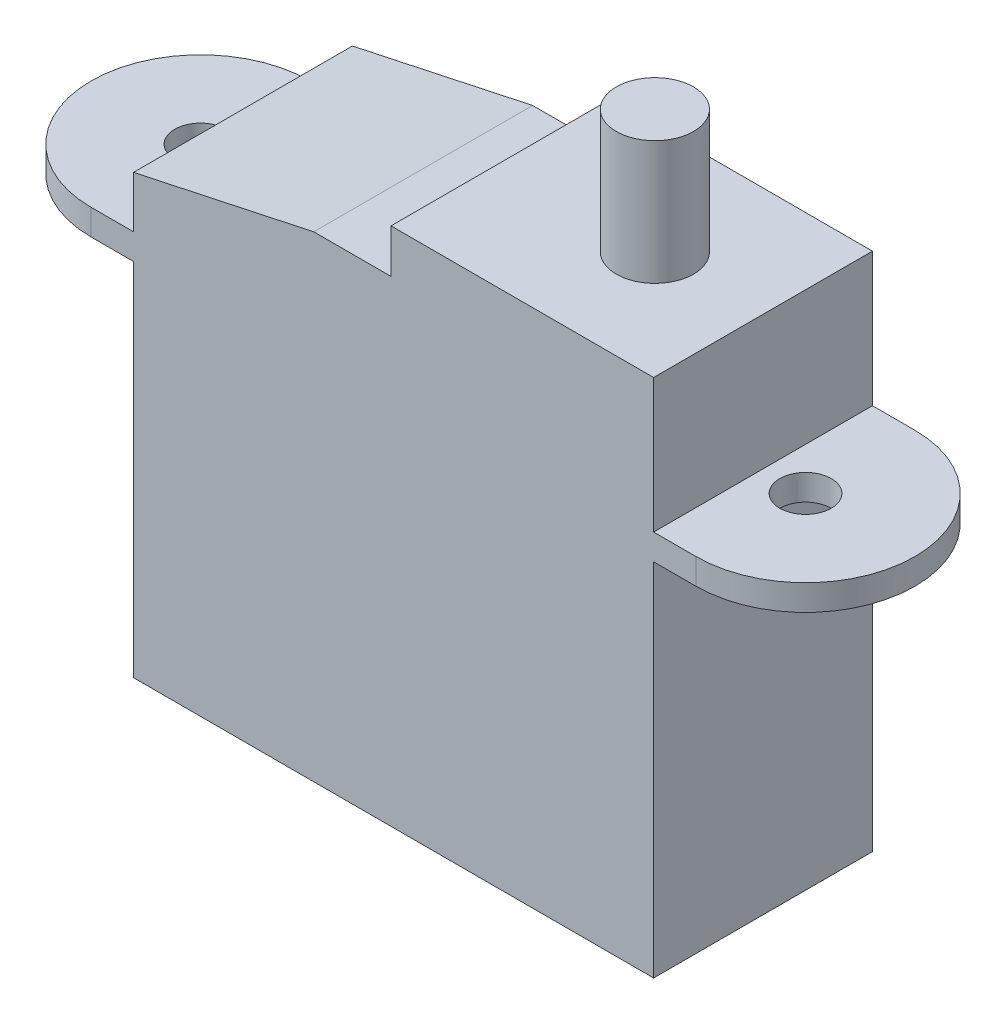
ISO-10303-21;
HEADER;
FILE_DESCRIPTION(('STEP AP214'),'2;1');
FILE_NAME('part.step','',(''),(''),'','','');
FILE_SCHEMA(('AUTOMOTIVE_DESIGN { 1 0 10303 214 1 1 1 1 }'));
ENDSEC;
DATA;
#1=APPLICATION_CONTEXT('core data for automotive mechanical design processes');
#2=APPLICATION_PROTOCOL_DEFINITION('international standard','automotive_design',2000,#1);
#3=PRODUCT_CONTEXT('',#1,'mechanical');
#4=PRODUCT('Part','Part','',(#3));
#5=PRODUCT_RELATED_PRODUCT_CATEGORY('part','',(#4));
#6=PRODUCT_DEFINITION_FORMATION('','',#4);
#7=PRODUCT_DEFINITION_CONTEXT('part definition',#1,'design');
#8=PRODUCT_DEFINITION('design','',#6,#7);
#9=PRODUCT_DEFINITION_SHAPE('','',#8);
#10=(LENGTH_UNIT() NAMED_UNIT(*) SI_UNIT(.MILLI.,.METRE.));
#11=(NAMED_UNIT(*) PLANE_ANGLE_UNIT() SI_UNIT($,.RADIAN.));
#12=(NAMED_UNIT(*) SI_UNIT($,.STERADIAN.) SOLID_ANGLE_UNIT());
#13=UNCERTAINTY_MEASURE_WITH_UNIT(LENGTH_MEASURE(1.E-05),#10,'distance_accuracy_value','');
#14=(GEOMETRIC_REPRESENTATION_CONTEXT(3) GLOBAL_UNCERTAINTY_ASSIGNED_CONTEXT((#13)) GLOBAL_UNIT_ASSIGNED_CONTEXT((#10,
#11,#12)) REPRESENTATION_CONTEXT('',''));
#15=CARTESIAN_POINT('',(0.,0.,0.));
#16=DIRECTION('',(0.,0.,1.));
#17=DIRECTION('',(1.,0.,0.));
#18=AXIS2_PLACEMENT_3D('',#15,#16,#17);
#19=CARTESIAN_POINT('',(-1.65,15.,-4.25));
#20=DIRECTION('',(0.,1.,0.));
#21=DIRECTION('',(0.,0.,1.));
#22=AXIS2_PLACEMENT_3D('',#19,#20,#21);
#23=PLANE('',#22);
#24=CARTESIAN_POINT('',(-1.65,15.,-4.25));
#25=DIRECTION('',(0.,1.,0.));
#26=DIRECTION('',(0.,0.,1.));
#27=AXIS2_PLACEMENT_3D('',#24,#25,#26);
#28=CIRCLE('',#27,1.);
#29=CARTESIAN_POINT('',(-1.65,15.,-3.25));
#30=VERTEX_POINT('',#29);
#31=EDGE_CURVE('E242',#30,#30,#28,.T.);
#32=ORIENTED_EDGE('',*,*,#31,.F.);
#33=EDGE_LOOP('',(#32));
#34=FACE_BOUND('',#33,.T.);
#35=DIRECTION('',(0.,0.,1.));
#36=VECTOR('',#35,1.);
#37=CARTESIAN_POINT('',(0.,15.,0.));
#38=LINE('',#37,#36);
#39=CARTESIAN_POINT('',(0.,15.,-8.5));
#40=VERTEX_POINT('',#39);
#41=CARTESIAN_POINT('',(0.,15.,0.));
#42=VERTEX_POINT('',#41);
#43=EDGE_CURVE('E164',#40,#42,#38,.T.);
#44=ORIENTED_EDGE('',*,*,#43,.F.);
#45=DIRECTION('',(-1.,0.,0.));
#46=VECTOR('',#45,1.);
#47=CARTESIAN_POINT('',(-1.65,15.,-8.5));
#48=LINE('',#47,#46);
#49=CARTESIAN_POINT('',(-1.65,15.,-8.5));
#50=VERTEX_POINT('',#49);
#51=EDGE_CURVE('E183',#40,#50,#48,.T.);
#52=ORIENTED_EDGE('',*,*,#51,.T.);
#53=CARTESIAN_POINT('',(-1.65,15.,-4.25));
#54=DIRECTION('',(0.,1.,0.));
#55=DIRECTION('',(0.,0.,1.));
#56=AXIS2_PLACEMENT_3D('',#53,#54,#55);
#57=CIRCLE('',#56,4.25);
#58=CARTESIAN_POINT('',(-1.65,15.,0.));
#59=VERTEX_POINT('',#58);
#60=EDGE_CURVE('E174',#50,#59,#57,.T.);
#61=ORIENTED_EDGE('',*,*,#60,.T.);
#62=DIRECTION('',(1.,0.,0.));
#63=VECTOR('',#62,1.);
#64=CARTESIAN_POINT('',(-1.65,15.,0.));
#65=LINE('',#64,#63);
#66=EDGE_CURVE('E179',#59,#42,#65,.T.);
#67=ORIENTED_EDGE('',*,*,#66,.T.);
#68=EDGE_LOOP('',(#44,#52,#61,#67));
#69=FACE_BOUND('',#68,.T.);
#70=ADVANCED_FACE('F35',(#34,#69),#23,.T.);
#71=CARTESIAN_POINT('',(0.,14.,0.));
#72=DIRECTION('',(1.,0.,0.));
#73=DIRECTION('',(0.,0.,-1.));
#74=AXIS2_PLACEMENT_3D('',#71,#72,#73);
#75=PLANE('',#74);
#76=DIRECTION('',(0.,0.,1.));
#77=VECTOR('',#76,1.);
#78=CARTESIAN_POINT('',(0.,0.,0.));
#79=LINE('',#78,#77);
#80=CARTESIAN_POINT('',(0.,0.,-8.5));
#81=VERTEX_POINT('',#80);
#82=CARTESIAN_POINT('',(0.,0.,0.));
#83=VERTEX_POINT('',#82);
#84=EDGE_CURVE('E212',#81,#83,#79,.T.);
#85=ORIENTED_EDGE('',*,*,#84,.T.);
#86=DIRECTION('',(0.,-1.,0.));
#87=VECTOR('',#86,1.);
#88=CARTESIAN_POINT('',(0.,14.,0.));
#89=LINE('',#88,#87);
#90=CARTESIAN_POINT('',(0.,14.,0.));
#91=VERTEX_POINT('',#90);
#92=EDGE_CURVE('E236',#91,#83,#89,.T.);
#93=ORIENTED_EDGE('',*,*,#92,.F.);
#94=DIRECTION('',(0.,0.,1.));
#95=VECTOR('',#94,1.);
#96=CARTESIAN_POINT('',(0.,14.,0.));
#97=LINE('',#96,#95);
#98=CARTESIAN_POINT('',(0.,14.,-8.5));
#99=VERTEX_POINT('',#98);
#100=EDGE_CURVE('E213',#99,#91,#97,.T.);
#101=ORIENTED_EDGE('',*,*,#100,.F.);
#102=DIRECTION('',(0.,-1.,0.));
#103=VECTOR('',#102,1.);
#104=CARTESIAN_POINT('',(0.,14.,-8.5));
#105=LINE('',#104,#103);
#106=EDGE_CURVE('E220',#99,#81,#105,.T.);
#107=ORIENTED_EDGE('',*,*,#106,.T.);
#108=EDGE_LOOP('',(#85,#93,#101,#107));
#109=FACE_BOUND('',#108,.T.);
#110=ADVANCED_FACE('F37',(#109),#75,.F.);
#111=CARTESIAN_POINT('',(0.,14.,0.));
#112=DIRECTION('',(0.,0.,-1.));
#113=DIRECTION('',(-1.,0.,0.));
#114=AXIS2_PLACEMENT_3D('',#111,#112,#113);
#115=PLANE('',#114);
#116=DIRECTION('',(-1.,0.,0.));
#117=VECTOR('',#116,1.);
#118=CARTESIAN_POINT('',(0.,20.2,0.));
#119=LINE('',#118,#117);
#120=CARTESIAN_POINT('',(20.2,20.2,0.));
#121=VERTEX_POINT('',#120);
#122=CARTESIAN_POINT('',(10.,20.2,0.));
#123=VERTEX_POINT('',#122);
#124=EDGE_CURVE('E192',#121,#123,#119,.T.);
#125=ORIENTED_EDGE('',*,*,#124,.T.);
#126=DIRECTION('',(0.,1.,0.));
#127=VECTOR('',#126,1.);
#128=CARTESIAN_POINT('',(10.,18.5,0.));
#129=LINE('',#128,#127);
#130=CARTESIAN_POINT('',(10.,18.5,0.));
#131=VERTEX_POINT('',#130);
#132=EDGE_CURVE('E50',#131,#123,#129,.T.);
#133=ORIENTED_EDGE('',*,*,#132,.F.);
#134=DIRECTION('',(1.,0.,0.));
#135=VECTOR('',#134,1.);
#136=CARTESIAN_POINT('',(7.,18.5,0.));
#137=LINE('',#136,#135);
#138=CARTESIAN_POINT('',(7.,18.5,0.));
#139=VERTEX_POINT('',#138);
#140=EDGE_CURVE('E160',#139,#131,#137,.T.);
#141=ORIENTED_EDGE('',*,*,#140,.F.);
#142=DIRECTION('',(0.977802414077409,0.209529088730874,0.));
#143=VECTOR('',#142,1.);
#144=CARTESIAN_POINT('',(0.,17.,0.));
#145=LINE('',#144,#143);
#146=CARTESIAN_POINT('',(0.,17.,0.));
#147=VERTEX_POINT('',#146);
#148=EDGE_CURVE('E147',#147,#139,#145,.T.);
#149=ORIENTED_EDGE('',*,*,#148,.F.);
#150=DIRECTION('',(0.,-1.,0.));
#151=VECTOR('',#150,1.);
#152=CARTESIAN_POINT('',(0.,62.3155196151038,0.));
#153=LINE('',#152,#151);
#154=EDGE_CURVE('E157',#147,#42,#153,.T.);
#155=ORIENTED_EDGE('',*,*,#154,.T.);
#156=ORIENTED_EDGE('',*,*,#66,.F.);
#157=DIRECTION('',(0.,-1.,0.));
#158=VECTOR('',#157,1.);
#159=CARTESIAN_POINT('',(-1.65,15.,0.));
#160=LINE('',#159,#158);
#161=CARTESIAN_POINT('',(-1.65,14.,0.));
#162=VERTEX_POINT('',#161);
#163=EDGE_CURVE('E209',#59,#162,#160,.T.);
#164=ORIENTED_EDGE('',*,*,#163,.T.);
#165=DIRECTION('',(1.,0.,0.));
#166=VECTOR('',#165,1.);
#167=CARTESIAN_POINT('',(-1.65,14.,0.));
#168=LINE('',#167,#166);
#169=EDGE_CURVE('E193',#162,#91,#168,.T.);
#170=ORIENTED_EDGE('',*,*,#169,.T.);
#171=ORIENTED_EDGE('',*,*,#92,.T.);
#172=DIRECTION('',(1.,0.,0.));
#173=VECTOR('',#172,1.);
#174=CARTESIAN_POINT('',(0.,0.,0.));
#175=LINE('',#174,#173);
#176=CARTESIAN_POINT('',(20.2,0.,0.));
#177=VERTEX_POINT('',#176);
#178=EDGE_CURVE('E223',#83,#177,#175,.T.);
#179=ORIENTED_EDGE('',*,*,#178,.T.);
#180=DIRECTION('',(0.,-1.,0.));
#181=VECTOR('',#180,1.);
#182=CARTESIAN_POINT('',(20.2,14.,0.));
#183=LINE('',#182,#181);
#184=CARTESIAN_POINT('',(20.2,14.,0.));
#185=VERTEX_POINT('',#184);
#186=EDGE_CURVE('E233',#185,#177,#183,.T.);
#187=ORIENTED_EDGE('',*,*,#186,.F.);
#188=CARTESIAN_POINT('',(21.85,14.,0.));
#189=VERTEX_POINT('',#188);
#190=EDGE_CURVE('E191',#185,#189,#168,.T.);
#191=ORIENTED_EDGE('',*,*,#190,.T.);
#192=DIRECTION('',(0.,-1.,0.));
#193=VECTOR('',#192,1.);
#194=CARTESIAN_POINT('',(21.85,15.,0.));
#195=LINE('',#194,#193);
#196=CARTESIAN_POINT('',(21.85,15.,0.));
#197=VERTEX_POINT('',#196);
#198=EDGE_CURVE('E206',#197,#189,#195,.T.);
#199=ORIENTED_EDGE('',*,*,#198,.F.);
#200=CARTESIAN_POINT('',(20.2,15.,0.));
#201=VERTEX_POINT('',#200);
#202=EDGE_CURVE('E177',#201,#197,#65,.T.);
#203=ORIENTED_EDGE('',*,*,#202,.F.);
#204=DIRECTION('',(0.,-1.,0.));
#205=VECTOR('',#204,1.);
#206=CARTESIAN_POINT('',(20.2,62.3155196151038,0.));
#207=LINE('',#206,#205);
#208=EDGE_CURVE('E166',#121,#201,#207,.T.);
#209=ORIENTED_EDGE('',*,*,#208,.F.);
#210=EDGE_LOOP('',(#125,#133,#141,#149,#155,#156,#164,#170,#171,#179,#187,#191,#199,#203,#209));
#211=FACE_BOUND('',#210,.T.);
#212=ADVANCED_FACE('F156',(#211),#115,.F.);
#213=CARTESIAN_POINT('',(20.2,14.,0.));
#214=DIRECTION('',(-1.,0.,0.));
#215=DIRECTION('',(0.,0.,1.));
#216=AXIS2_PLACEMENT_3D('',#213,#214,#215);
#217=PLANE('',#216);
#218=DIRECTION('',(0.,0.,-1.));
#219=VECTOR('',#218,1.);
#220=CARTESIAN_POINT('',(20.2,0.,0.));
#221=LINE('',#220,#219);
#222=CARTESIAN_POINT('',(20.2,0.,-8.5));
#223=VERTEX_POINT('',#222);
#224=EDGE_CURVE('E225',#177,#223,#221,.T.);
#225=ORIENTED_EDGE('',*,*,#224,.T.);
#226=DIRECTION('',(0.,-1.,0.));
#227=VECTOR('',#226,1.);
#228=CARTESIAN_POINT('',(20.2,14.,-8.5));
#229=LINE('',#228,#227);
#230=CARTESIAN_POINT('',(20.2,14.,-8.5));
#231=VERTEX_POINT('',#230);
#232=EDGE_CURVE('E230',#231,#223,#229,.T.);
#233=ORIENTED_EDGE('',*,*,#232,.F.);
#234=DIRECTION('',(0.,0.,-1.));
#235=VECTOR('',#234,1.);
#236=CARTESIAN_POINT('',(20.2,14.,0.));
#237=LINE('',#236,#235);
#238=EDGE_CURVE('E216',#185,#231,#237,.T.);
#239=ORIENTED_EDGE('',*,*,#238,.F.);
#240=ORIENTED_EDGE('',*,*,#186,.T.);
#241=EDGE_LOOP('',(#225,#233,#239,#240));
#242=FACE_BOUND('',#241,.T.);
#243=ADVANCED_FACE('F297',(#242),#217,.F.);
#244=CARTESIAN_POINT('',(0.,14.,-8.5));
#245=DIRECTION('',(0.,0.,1.));
#246=DIRECTION('',(1.,0.,0.));
#247=AXIS2_PLACEMENT_3D('',#244,#245,#246);
#248=PLANE('',#247);
#249=DIRECTION('',(1.,0.,0.));
#250=VECTOR('',#249,1.);
#251=CARTESIAN_POINT('',(0.,18.5,-8.5));
#252=LINE('',#251,#250);
#253=CARTESIAN_POINT('',(7.,18.5,-8.5));
#254=VERTEX_POINT('',#253);
#255=CARTESIAN_POINT('',(10.,18.5,-8.5));
#256=VERTEX_POINT('',#255);
#257=EDGE_CURVE('E43',#254,#256,#252,.T.);
#258=ORIENTED_EDGE('',*,*,#257,.T.);
#259=DIRECTION('',(0.,1.,0.));
#260=VECTOR('',#259,1.);
#261=CARTESIAN_POINT('',(10.,14.,-8.5));
#262=LINE('',#261,#260);
#263=CARTESIAN_POINT('',(10.,20.2,-8.5));
#264=VERTEX_POINT('',#263);
#265=EDGE_CURVE('E260',#256,#264,#262,.T.);
#266=ORIENTED_EDGE('',*,*,#265,.T.);
#267=DIRECTION('',(1.,0.,0.));
#268=VECTOR('',#267,1.);
#269=CARTESIAN_POINT('',(0.,20.2,-8.5));
#270=LINE('',#269,#268);
#271=CARTESIAN_POINT('',(20.2,20.2,-8.5));
#272=VERTEX_POINT('',#271);
#273=EDGE_CURVE('E165',#264,#272,#270,.T.);
#274=ORIENTED_EDGE('',*,*,#273,.T.);
#275=DIRECTION('',(0.,-1.,0.));
#276=VECTOR('',#275,1.);
#277=CARTESIAN_POINT('',(20.2,62.3155196151038,-8.5));
#278=LINE('',#277,#276);
#279=CARTESIAN_POINT('',(20.2,15.,-8.5));
#280=VERTEX_POINT('',#279);
#281=EDGE_CURVE('E170',#272,#280,#278,.T.);
#282=ORIENTED_EDGE('',*,*,#281,.T.);
#283=CARTESIAN_POINT('',(21.85,15.,-8.5));
#284=VERTEX_POINT('',#283);
#285=EDGE_CURVE('E184',#284,#280,#48,.T.);
#286=ORIENTED_EDGE('',*,*,#285,.F.);
#287=DIRECTION('',(0.,-1.,0.));
#288=VECTOR('',#287,1.);
#289=CARTESIAN_POINT('',(21.85,15.,-8.5));
#290=LINE('',#289,#288);
#291=CARTESIAN_POINT('',(21.85,14.,-8.5));
#292=VERTEX_POINT('',#291);
#293=EDGE_CURVE('E203',#284,#292,#290,.T.);
#294=ORIENTED_EDGE('',*,*,#293,.T.);
#295=DIRECTION('',(-1.,0.,0.));
#296=VECTOR('',#295,1.);
#297=CARTESIAN_POINT('',(-1.65,14.,-8.5));
#298=LINE('',#297,#296);
#299=EDGE_CURVE('E178',#292,#231,#298,.T.);
#300=ORIENTED_EDGE('',*,*,#299,.T.);
#301=ORIENTED_EDGE('',*,*,#232,.T.);
#302=DIRECTION('',(-1.,0.,0.));
#303=VECTOR('',#302,1.);
#304=CARTESIAN_POINT('',(0.,0.,-8.5));
#305=LINE('',#304,#303);
#306=EDGE_CURVE('E217',#223,#81,#305,.T.);
#307=ORIENTED_EDGE('',*,*,#306,.T.);
#308=ORIENTED_EDGE('',*,*,#106,.F.);
#309=CARTESIAN_POINT('',(-1.65,14.,-8.5));
#310=VERTEX_POINT('',#309);
#311=EDGE_CURVE('E198',#99,#310,#298,.T.);
#312=ORIENTED_EDGE('',*,*,#311,.T.);
#313=DIRECTION('',(0.,-1.,0.));
#314=VECTOR('',#313,1.);
#315=CARTESIAN_POINT('',(-1.65,15.,-8.5));
#316=LINE('',#315,#314);
#317=EDGE_CURVE('E187',#50,#310,#316,.T.);
#318=ORIENTED_EDGE('',*,*,#317,.F.);
#319=ORIENTED_EDGE('',*,*,#51,.F.);
#320=DIRECTION('',(0.,-1.,0.));
#321=VECTOR('',#320,1.);
#322=CARTESIAN_POINT('',(0.,62.3155196151038,-8.5));
#323=LINE('',#322,#321);
#324=CARTESIAN_POINT('',(0.,17.,-8.5));
#325=VERTEX_POINT('',#324);
#326=EDGE_CURVE('E58',#325,#40,#323,.T.);
#327=ORIENTED_EDGE('',*,*,#326,.F.);
#328=DIRECTION('',(0.97780241407741,0.209529088730874,0.));
#329=VECTOR('',#328,1.);
#330=CARTESIAN_POINT('',(-0.614634146341461,16.8682926829268,-8.5));
#331=LINE('',#330,#329);
#332=EDGE_CURVE('E150',#325,#254,#331,.T.);
#333=ORIENTED_EDGE('',*,*,#332,.T.);
#334=EDGE_LOOP('',(#258,#266,#274,#282,#286,#294,#300,#301,#307,#308,#312,#318,#319,#327,#333));
#335=FACE_BOUND('',#334,.T.);
#336=ADVANCED_FACE('F275',(#335),#248,.F.);
#337=CARTESIAN_POINT('',(0.,0.,0.));
#338=DIRECTION('',(0.,-1.,0.));
#339=DIRECTION('',(0.,0.,-1.));
#340=AXIS2_PLACEMENT_3D('',#337,#338,#339);
#341=PLANE('',#340);
#342=ORIENTED_EDGE('',*,*,#84,.F.);
#343=ORIENTED_EDGE('',*,*,#306,.F.);
#344=ORIENTED_EDGE('',*,*,#224,.F.);
#345=ORIENTED_EDGE('',*,*,#178,.F.);
#346=EDGE_LOOP('',(#342,#343,#344,#345));
#347=FACE_BOUND('',#346,.T.);
#348=ADVANCED_FACE('F302',(#347),#341,.T.);
#349=CARTESIAN_POINT('',(-1.65,14.,-4.25));
#350=DIRECTION('',(0.,1.,0.));
#351=DIRECTION('',(0.,0.,1.));
#352=AXIS2_PLACEMENT_3D('',#349,#350,#351);
#353=PLANE('',#352);
#354=CARTESIAN_POINT('',(-1.65,14.,-4.25));
#355=DIRECTION('',(0.,1.,0.));
#356=DIRECTION('',(0.,0.,1.));
#357=AXIS2_PLACEMENT_3D('',#354,#355,#356);
#358=CIRCLE('',#357,1.);
#359=CARTESIAN_POINT('',(-1.65,14.,-3.25));
#360=VERTEX_POINT('',#359);
#361=EDGE_CURVE('E161',#360,#360,#358,.T.);
#362=ORIENTED_EDGE('',*,*,#361,.T.);
#363=EDGE_LOOP('',(#362));
#364=FACE_BOUND('',#363,.T.);
#365=ORIENTED_EDGE('',*,*,#311,.F.);
#366=ORIENTED_EDGE('',*,*,#100,.T.);
#367=ORIENTED_EDGE('',*,*,#169,.F.);
#368=CARTESIAN_POINT('',(-1.65,14.,-4.25));
#369=DIRECTION('',(0.,1.,0.));
#370=DIRECTION('',(0.,0.,1.));
#371=AXIS2_PLACEMENT_3D('',#368,#369,#370);
#372=CIRCLE('',#371,4.25);
#373=EDGE_CURVE('E188',#310,#162,#372,.T.);
#374=ORIENTED_EDGE('',*,*,#373,.F.);
#375=EDGE_LOOP('',(#365,#366,#367,#374));
#376=FACE_BOUND('',#375,.T.);
#377=ADVANCED_FACE('F314',(#364,#376),#353,.F.);
#378=CARTESIAN_POINT('',(21.85,14.,-4.25));
#379=DIRECTION('',(0.,1.,0.));
#380=DIRECTION('',(0.,0.,1.));
#381=AXIS2_PLACEMENT_3D('',#378,#379,#380);
#382=CIRCLE('',#381,1.);
#383=CARTESIAN_POINT('',(21.85,14.,-3.25));
#384=VERTEX_POINT('',#383);
#385=EDGE_CURVE('E246',#384,#384,#382,.T.);
#386=ORIENTED_EDGE('',*,*,#385,.T.);
#387=EDGE_LOOP('',(#386));
#388=FACE_BOUND('',#387,.T.);
#389=ORIENTED_EDGE('',*,*,#190,.F.);
#390=ORIENTED_EDGE('',*,*,#238,.T.);
#391=ORIENTED_EDGE('',*,*,#299,.F.);
#392=CARTESIAN_POINT('',(21.85,14.,-4.25));
#393=DIRECTION('',(0.,1.,0.));
#394=DIRECTION('',(0.,0.,1.));
#395=AXIS2_PLACEMENT_3D('',#392,#393,#394);
#396=CIRCLE('',#395,4.25);
#397=EDGE_CURVE('E196',#189,#292,#396,.T.);
#398=ORIENTED_EDGE('',*,*,#397,.F.);
#399=EDGE_LOOP('',(#389,#390,#391,#398));
#400=FACE_BOUND('',#399,.T.);
#401=ADVANCED_FACE('F294',(#388,#400),#353,.F.);
#402=CARTESIAN_POINT('',(-1.65,15.,-4.25));
#403=DIRECTION('',(0.,-1.,0.));
#404=DIRECTION('',(0.,0.,-1.));
#405=AXIS2_PLACEMENT_3D('',#402,#403,#404);
#406=CYLINDRICAL_SURFACE('',#405,4.25);
#407=ORIENTED_EDGE('',*,*,#373,.T.);
#408=ORIENTED_EDGE('',*,*,#163,.F.);
#409=ORIENTED_EDGE('',*,*,#60,.F.);
#410=ORIENTED_EDGE('',*,*,#317,.T.);
#411=EDGE_LOOP('',(#407,#408,#409,#410));
#412=FACE_BOUND('',#411,.T.);
#413=ADVANCED_FACE('F312',(#412),#406,.T.);
#414=CARTESIAN_POINT('',(21.85,15.,-4.25));
#415=DIRECTION('',(0.,-1.,0.));
#416=DIRECTION('',(0.,0.,-1.));
#417=AXIS2_PLACEMENT_3D('',#414,#415,#416);
#418=CYLINDRICAL_SURFACE('',#417,4.25);
#419=ORIENTED_EDGE('',*,*,#397,.T.);
#420=ORIENTED_EDGE('',*,*,#293,.F.);
#421=CARTESIAN_POINT('',(21.85,15.,-4.25));
#422=DIRECTION('',(0.,1.,0.));
#423=DIRECTION('',(0.,0.,1.));
#424=AXIS2_PLACEMENT_3D('',#421,#422,#423);
#425=CIRCLE('',#424,4.25);
#426=EDGE_CURVE('E181',#197,#284,#425,.T.);
#427=ORIENTED_EDGE('',*,*,#426,.F.);
#428=ORIENTED_EDGE('',*,*,#198,.T.);
#429=EDGE_LOOP('',(#419,#420,#427,#428));
#430=FACE_BOUND('',#429,.T.);
#431=ADVANCED_FACE('F291',(#430),#418,.T.);
#432=CARTESIAN_POINT('',(21.85,15.,-4.25));
#433=DIRECTION('',(0.,1.,0.));
#434=DIRECTION('',(0.,0.,1.));
#435=AXIS2_PLACEMENT_3D('',#432,#433,#434);
#436=CIRCLE('',#435,1.);
#437=CARTESIAN_POINT('',(21.85,15.,-3.25));
#438=VERTEX_POINT('',#437);
#439=EDGE_CURVE('E251',#438,#438,#436,.T.);
#440=ORIENTED_EDGE('',*,*,#439,.F.);
#441=EDGE_LOOP('',(#440));
#442=FACE_BOUND('',#441,.T.);
#443=DIRECTION('',(0.,0.,-1.));
#444=VECTOR('',#443,1.);
#445=CARTESIAN_POINT('',(20.2,15.,0.));
#446=LINE('',#445,#444);
#447=EDGE_CURVE('E269',#201,#280,#446,.T.);
#448=ORIENTED_EDGE('',*,*,#447,.F.);
#449=ORIENTED_EDGE('',*,*,#202,.T.);
#450=ORIENTED_EDGE('',*,*,#426,.T.);
#451=ORIENTED_EDGE('',*,*,#285,.T.);
#452=EDGE_LOOP('',(#448,#449,#450,#451));
#453=FACE_BOUND('',#452,.T.);
#454=ADVANCED_FACE('F281',(#442,#453),#23,.T.);
#455=CARTESIAN_POINT('',(20.2,62.3155196151038,0.));
#456=DIRECTION('',(-1.,0.,0.));
#457=DIRECTION('',(0.,0.,1.));
#458=AXIS2_PLACEMENT_3D('',#455,#456,#457);
#459=PLANE('',#458);
#460=ORIENTED_EDGE('',*,*,#447,.T.);
#461=ORIENTED_EDGE('',*,*,#281,.F.);
#462=DIRECTION('',(0.,0.,1.));
#463=VECTOR('',#462,1.);
#464=CARTESIAN_POINT('',(20.2,20.2,0.));
#465=LINE('',#464,#463);
#466=EDGE_CURVE('E168',#272,#121,#465,.T.);
#467=ORIENTED_EDGE('',*,*,#466,.T.);
#468=ORIENTED_EDGE('',*,*,#208,.T.);
#469=EDGE_LOOP('',(#460,#461,#467,#468));
#470=FACE_BOUND('',#469,.T.);
#471=ADVANCED_FACE('F285',(#470),#459,.F.);
#472=CARTESIAN_POINT('',(0.,62.3155196151038,0.));
#473=DIRECTION('',(1.,0.,0.));
#474=DIRECTION('',(0.,0.,-1.));
#475=AXIS2_PLACEMENT_3D('',#472,#473,#474);
#476=PLANE('',#475);
#477=ORIENTED_EDGE('',*,*,#154,.F.);
#478=DIRECTION('',(0.,0.,-1.));
#479=VECTOR('',#478,1.);
#480=CARTESIAN_POINT('',(0.,17.,0.));
#481=LINE('',#480,#479);
#482=EDGE_CURVE('E143',#147,#325,#481,.T.);
#483=ORIENTED_EDGE('',*,*,#482,.T.);
#484=ORIENTED_EDGE('',*,*,#326,.T.);
#485=ORIENTED_EDGE('',*,*,#43,.T.);
#486=EDGE_LOOP('',(#477,#483,#484,#485));
#487=FACE_BOUND('',#486,.T.);
#488=ADVANCED_FACE('F163',(#487),#476,.F.);
#489=CARTESIAN_POINT('',(0.,20.2,0.));
#490=DIRECTION('',(0.,-1.,0.));
#491=DIRECTION('',(0.,0.,-1.));
#492=AXIS2_PLACEMENT_3D('',#489,#490,#491);
#493=PLANE('',#492);
#494=CARTESIAN_POINT('',(16.,20.2,-4.25));
#495=DIRECTION('',(0.,-1.,0.));
#496=DIRECTION('',(0.,0.,-1.));
#497=AXIS2_PLACEMENT_3D('',#494,#495,#496);
#498=CIRCLE('',#497,1.5);
#499=CARTESIAN_POINT('',(16.,20.2,-5.75));
#500=VERTEX_POINT('',#499);
#501=EDGE_CURVE('E12',#500,#500,#498,.F.);
#502=ORIENTED_EDGE('',*,*,#501,.F.);
#503=EDGE_LOOP('',(#502));
#504=FACE_BOUND('',#503,.T.);
#505=ORIENTED_EDGE('',*,*,#273,.F.);
#506=DIRECTION('',(0.,0.,1.));
#507=VECTOR('',#506,1.);
#508=CARTESIAN_POINT('',(10.,20.2,0.));
#509=LINE('',#508,#507);
#510=EDGE_CURVE('E152',#264,#123,#509,.T.);
#511=ORIENTED_EDGE('',*,*,#510,.T.);
#512=ORIENTED_EDGE('',*,*,#124,.F.);
#513=ORIENTED_EDGE('',*,*,#466,.F.);
#514=EDGE_LOOP('',(#505,#511,#512,#513));
#515=FACE_BOUND('',#514,.T.);
#516=ADVANCED_FACE('F321',(#504,#515),#493,.F.);
#517=CARTESIAN_POINT('',(7.,18.5,-20.2));
#518=DIRECTION('',(0.,-1.,0.));
#519=DIRECTION('',(0.,0.,-1.));
#520=AXIS2_PLACEMENT_3D('',#517,#518,#519);
#521=PLANE('',#520);
#522=DIRECTION('',(0.,0.,1.));
#523=VECTOR('',#522,1.);
#524=CARTESIAN_POINT('',(7.,18.5,-20.2));
#525=LINE('',#524,#523);
#526=EDGE_CURVE('E257',#254,#139,#525,.T.);
#527=ORIENTED_EDGE('',*,*,#526,.T.);
#528=ORIENTED_EDGE('',*,*,#140,.T.);
#529=DIRECTION('',(0.,0.,1.));
#530=VECTOR('',#529,1.);
#531=CARTESIAN_POINT('',(10.,18.5,-20.2));
#532=LINE('',#531,#530);
#533=EDGE_CURVE('E258',#256,#131,#532,.T.);
#534=ORIENTED_EDGE('',*,*,#533,.F.);
#535=ORIENTED_EDGE('',*,*,#257,.F.);
#536=EDGE_LOOP('',(#527,#528,#534,#535));
#537=FACE_BOUND('',#536,.T.);
#538=ADVANCED_FACE('F318',(#537),#521,.F.);
#539=CARTESIAN_POINT('',(0.,17.,-20.2));
#540=DIRECTION('',(0.209529088730874,-0.977802414077409,0.));
#541=DIRECTION('',(0.97780241407741,0.209529088730874,0.));
#542=AXIS2_PLACEMENT_3D('',#539,#540,#541);
#543=PLANE('',#542);
#544=ORIENTED_EDGE('',*,*,#482,.F.);
#545=ORIENTED_EDGE('',*,*,#148,.T.);
#546=ORIENTED_EDGE('',*,*,#526,.F.);
#547=ORIENTED_EDGE('',*,*,#332,.F.);
#548=EDGE_LOOP('',(#544,#545,#546,#547));
#549=FACE_BOUND('',#548,.T.);
#550=ADVANCED_FACE('F145',(#549),#543,.F.);
#551=CARTESIAN_POINT('',(10.,18.5,-20.2));
#552=DIRECTION('',(1.,0.,0.));
#553=DIRECTION('',(0.,0.,-1.));
#554=AXIS2_PLACEMENT_3D('',#551,#552,#553);
#555=PLANE('',#554);
#556=ORIENTED_EDGE('',*,*,#533,.T.);
#557=ORIENTED_EDGE('',*,*,#132,.T.);
#558=ORIENTED_EDGE('',*,*,#510,.F.);
#559=ORIENTED_EDGE('',*,*,#265,.F.);
#560=EDGE_LOOP('',(#556,#557,#558,#559));
#561=FACE_BOUND('',#560,.T.);
#562=ADVANCED_FACE('F319',(#561),#555,.F.);
#563=CARTESIAN_POINT('',(-1.65,0.,-4.25));
#564=DIRECTION('',(0.,1.,0.));
#565=DIRECTION('',(0.,0.,1.));
#566=AXIS2_PLACEMENT_3D('',#563,#564,#565);
#567=CYLINDRICAL_SURFACE('',#566,1.);
#568=ORIENTED_EDGE('',*,*,#31,.T.);
#569=EDGE_LOOP('',(#568));
#570=FACE_BOUND('',#569,.T.);
#571=ORIENTED_EDGE('',*,*,#361,.F.);
#572=EDGE_LOOP('',(#571));
#573=FACE_BOUND('',#572,.T.);
#574=ADVANCED_FACE('F370',(#570,#573),#567,.F.);
#575=CARTESIAN_POINT('',(21.85,0.,-4.25));
#576=DIRECTION('',(0.,1.,0.));
#577=DIRECTION('',(0.,0.,1.));
#578=AXIS2_PLACEMENT_3D('',#575,#576,#577);
#579=CYLINDRICAL_SURFACE('',#578,1.);
#580=ORIENTED_EDGE('',*,*,#439,.T.);
#581=EDGE_LOOP('',(#580));
#582=FACE_BOUND('',#581,.T.);
#583=ORIENTED_EDGE('',*,*,#385,.F.);
#584=EDGE_LOOP('',(#583));
#585=FACE_BOUND('',#584,.T.);
#586=ADVANCED_FACE('F365',(#582,#585),#579,.F.);
#587=CARTESIAN_POINT('',(16.,54.2426406871193,-4.25));
#588=DIRECTION('',(0.,-1.,0.));
#589=DIRECTION('',(0.,0.,-1.));
#590=AXIS2_PLACEMENT_3D('',#587,#588,#589);
#591=CYLINDRICAL_SURFACE('',#590,1.5);
#592=CARTESIAN_POINT('',(16.,25.,-4.25));
#593=DIRECTION('',(0.,-1.,0.));
#594=DIRECTION('',(0.,0.,-1.));
#595=AXIS2_PLACEMENT_3D('',#592,#593,#594);
#596=CIRCLE('',#595,1.5);
#597=CARTESIAN_POINT('',(16.,25.,-5.75));
#598=VERTEX_POINT('',#597);
#599=EDGE_CURVE('E351',#598,#598,#596,.T.);
#600=ORIENTED_EDGE('',*,*,#599,.T.);
#601=EDGE_LOOP('',(#600));
#602=FACE_BOUND('',#601,.T.);
#603=ORIENTED_EDGE('',*,*,#501,.T.);
#604=EDGE_LOOP('',(#603));
#605=FACE_BOUND('',#604,.T.);
#606=ADVANCED_FACE('F356',(#602,#605),#591,.T.);
#607=CARTESIAN_POINT('',(0.,25.,0.));
#608=DIRECTION('',(0.,-1.,0.));
#609=DIRECTION('',(0.,0.,-1.));
#610=AXIS2_PLACEMENT_3D('',#607,#608,#609);
#611=PLANE('',#610);
#612=ORIENTED_EDGE('',*,*,#599,.F.);
#613=EDGE_LOOP('',(#612));
#614=FACE_BOUND('',#613,.T.);
#615=ADVANCED_FACE('F359',(#614),#611,.F.);
#616=CLOSED_SHELL('',(#70,#110,#212,#243,#336,#348,#377,#401,#413,#431,#454,#471,#488,#516,#538,
#550,#562,#574,#586,#606,#615));
#617=MANIFOLD_SOLID_BREP('B2',#616);
#618=ADVANCED_BREP_SHAPE_REPRESENTATION('',(#18,#617),#14);
#619=SHAPE_DEFINITION_REPRESENTATION(#9,#618);
ENDSEC;
END-ISO-10303-21;
